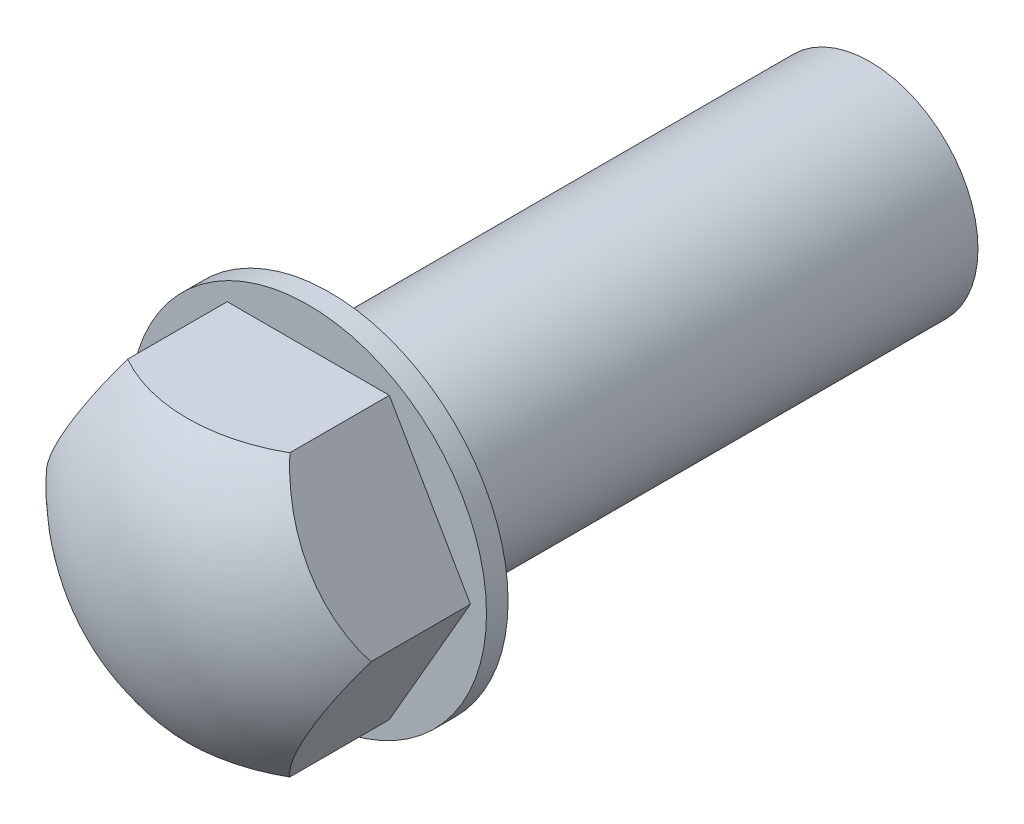
ISO-10303-21;
HEADER;
FILE_DESCRIPTION(('STEP AP214'),'2;1');
FILE_NAME('part.step','',(''),(''),'','','');
FILE_SCHEMA(('AUTOMOTIVE_DESIGN { 1 0 10303 214 1 1 1 1 }'));
ENDSEC;
DATA;
#1=APPLICATION_CONTEXT('core data for automotive mechanical design processes');
#2=APPLICATION_PROTOCOL_DEFINITION('international standard','automotive_design',2000,#1);
#3=PRODUCT_CONTEXT('',#1,'mechanical');
#4=PRODUCT('Part','Part','',(#3));
#5=PRODUCT_RELATED_PRODUCT_CATEGORY('part','',(#4));
#6=PRODUCT_DEFINITION_FORMATION('','',#4);
#7=PRODUCT_DEFINITION_CONTEXT('part definition',#1,'design');
#8=PRODUCT_DEFINITION('design','',#6,#7);
#9=PRODUCT_DEFINITION_SHAPE('','',#8);
#10=(LENGTH_UNIT() NAMED_UNIT(*) SI_UNIT(.MILLI.,.METRE.));
#11=(NAMED_UNIT(*) PLANE_ANGLE_UNIT() SI_UNIT($,.RADIAN.));
#12=(NAMED_UNIT(*) SI_UNIT($,.STERADIAN.) SOLID_ANGLE_UNIT());
#13=UNCERTAINTY_MEASURE_WITH_UNIT(LENGTH_MEASURE(1.E-05),#10,'distance_accuracy_value','');
#14=(GEOMETRIC_REPRESENTATION_CONTEXT(3) GLOBAL_UNCERTAINTY_ASSIGNED_CONTEXT((#13)) GLOBAL_UNIT_ASSIGNED_CONTEXT((#10,
#11,#12)) REPRESENTATION_CONTEXT('',''));
#15=CARTESIAN_POINT('',(0.,0.,0.));
#16=DIRECTION('',(0.,0.,1.));
#17=DIRECTION('',(1.,0.,0.));
#18=AXIS2_PLACEMENT_3D('',#15,#16,#17);
#19=CARTESIAN_POINT('',(0.,0.,0.));
#20=DIRECTION('',(0.,0.,1.));
#21=DIRECTION('',(1.,0.,0.));
#22=AXIS2_PLACEMENT_3D('',#19,#20,#21);
#23=PLANE('',#22);
#24=CARTESIAN_POINT('',(0.,0.,0.));
#25=DIRECTION('',(0.,0.,1.));
#26=DIRECTION('',(1.,0.,0.));
#27=AXIS2_PLACEMENT_3D('',#24,#25,#26);
#28=CIRCLE('',#27,16.5);
#29=CARTESIAN_POINT('',(16.5,0.,0.));
#30=VERTEX_POINT('',#29);
#31=EDGE_CURVE('E105',#30,#30,#28,.T.);
#32=ORIENTED_EDGE('',*,*,#31,.F.);
#33=EDGE_LOOP('',(#32));
#34=FACE_BOUND('',#33,.T.);
#35=CARTESIAN_POINT('',(0.,0.,0.));
#36=DIRECTION('',(0.,0.,1.));
#37=DIRECTION('',(1.,0.,0.));
#38=AXIS2_PLACEMENT_3D('',#35,#36,#37);
#39=CIRCLE('',#38,10.);
#40=CARTESIAN_POINT('',(10.,0.,0.));
#41=VERTEX_POINT('',#40);
#42=EDGE_CURVE('E11',#41,#41,#39,.F.);
#43=ORIENTED_EDGE('',*,*,#42,.F.);
#44=EDGE_LOOP('',(#43));
#45=FACE_BOUND('',#44,.T.);
#46=ADVANCED_FACE('F34',(#34,#45),#23,.F.);
#47=CARTESIAN_POINT('',(0.,0.,2.));
#48=DIRECTION('',(0.,0.,1.));
#49=DIRECTION('',(1.,0.,0.));
#50=AXIS2_PLACEMENT_3D('',#47,#48,#49);
#51=PLANE('',#50);
#52=CARTESIAN_POINT('',(0.,0.,2.));
#53=DIRECTION('',(0.,0.,1.));
#54=DIRECTION('',(1.,0.,0.));
#55=AXIS2_PLACEMENT_3D('',#52,#53,#54);
#56=CIRCLE('',#55,16.5);
#57=CARTESIAN_POINT('',(16.5,0.,2.));
#58=VERTEX_POINT('',#57);
#59=EDGE_CURVE('E43',#58,#58,#56,.T.);
#60=ORIENTED_EDGE('',*,*,#59,.T.);
#61=EDGE_LOOP('',(#60));
#62=FACE_BOUND('',#61,.T.);
#63=DIRECTION('',(-0.5,-0.866025403784439,0.));
#64=VECTOR('',#63,1.);
#65=CARTESIAN_POINT('',(-7.50555349946514,13.,2.));
#66=LINE('',#65,#64);
#67=CARTESIAN_POINT('',(-7.50555349946514,13.,2.));
#68=VERTEX_POINT('',#67);
#69=CARTESIAN_POINT('',(-15.0111069989303,0.,2.));
#70=VERTEX_POINT('',#69);
#71=EDGE_CURVE('E101',#68,#70,#66,.T.);
#72=ORIENTED_EDGE('',*,*,#71,.F.);
#73=DIRECTION('',(-1.,0.,0.));
#74=VECTOR('',#73,1.);
#75=CARTESIAN_POINT('',(7.50555349946514,13.,2.));
#76=LINE('',#75,#74);
#77=CARTESIAN_POINT('',(7.50555349946514,13.,2.));
#78=VERTEX_POINT('',#77);
#79=EDGE_CURVE('E109',#78,#68,#76,.T.);
#80=ORIENTED_EDGE('',*,*,#79,.F.);
#81=DIRECTION('',(-0.5,0.866025403784438,0.));
#82=VECTOR('',#81,1.);
#83=CARTESIAN_POINT('',(15.0111069989303,0.,2.));
#84=LINE('',#83,#82);
#85=CARTESIAN_POINT('',(15.0111069989303,0.,2.));
#86=VERTEX_POINT('',#85);
#87=EDGE_CURVE('E79',#86,#78,#84,.T.);
#88=ORIENTED_EDGE('',*,*,#87,.F.);
#89=DIRECTION('',(0.5,0.866025403784439,0.));
#90=VECTOR('',#89,1.);
#91=CARTESIAN_POINT('',(7.50555349946514,-13.,2.));
#92=LINE('',#91,#90);
#93=CARTESIAN_POINT('',(7.50555349946514,-13.,2.));
#94=VERTEX_POINT('',#93);
#95=EDGE_CURVE('E123',#94,#86,#92,.T.);
#96=ORIENTED_EDGE('',*,*,#95,.F.);
#97=DIRECTION('',(1.,0.,0.));
#98=VECTOR('',#97,1.);
#99=CARTESIAN_POINT('',(-7.50555349946514,-13.,2.));
#100=LINE('',#99,#98);
#101=CARTESIAN_POINT('',(-7.50555349946514,-13.,2.));
#102=VERTEX_POINT('',#101);
#103=EDGE_CURVE('E87',#102,#94,#100,.T.);
#104=ORIENTED_EDGE('',*,*,#103,.F.);
#105=DIRECTION('',(0.5,-0.866025403784438,0.));
#106=VECTOR('',#105,1.);
#107=CARTESIAN_POINT('',(-15.0111069989303,0.,2.));
#108=LINE('',#107,#106);
#109=EDGE_CURVE('E117',#70,#102,#108,.T.);
#110=ORIENTED_EDGE('',*,*,#109,.F.);
#111=EDGE_LOOP('',(#72,#80,#88,#96,#104,#110));
#112=FACE_BOUND('',#111,.T.);
#113=ADVANCED_FACE('F116',(#62,#112),#51,.T.);
#114=CARTESIAN_POINT('',(0.,0.,2.));
#115=DIRECTION('',(0.,0.,-1.));
#116=DIRECTION('',(-1.,0.,0.));
#117=AXIS2_PLACEMENT_3D('',#114,#115,#116);
#118=CYLINDRICAL_SURFACE('',#117,16.5);
#119=ORIENTED_EDGE('',*,*,#59,.F.);
#120=EDGE_LOOP('',(#119));
#121=FACE_BOUND('',#120,.T.);
#122=ORIENTED_EDGE('',*,*,#31,.T.);
#123=EDGE_LOOP('',(#122));
#124=FACE_BOUND('',#123,.T.);
#125=ADVANCED_FACE('F172',(#121,#124),#118,.T.);
#126=CARTESIAN_POINT('',(7.50555349946514,13.,17.));
#127=DIRECTION('',(0.,-1.,0.));
#128=DIRECTION('',(1.,0.,0.));
#129=AXIS2_PLACEMENT_3D('',#126,#127,#128);
#130=PLANE('',#129);
#131=ORIENTED_EDGE('',*,*,#79,.T.);
#132=DIRECTION('',(0.,0.,-1.));
#133=VECTOR('',#132,1.);
#134=CARTESIAN_POINT('',(-7.50555349946514,13.,17.));
#135=LINE('',#134,#133);
#136=CARTESIAN_POINT('',(-7.50555349946514,13.,11.2161517343993));
#137=VERTEX_POINT('',#136);
#138=EDGE_CURVE('E97',#137,#68,#135,.T.);
#139=ORIENTED_EDGE('',*,*,#138,.F.);
#140=CARTESIAN_POINT('',(0.,13.,-2.));
#141=DIRECTION('',(0.,-1.,0.));
#142=DIRECTION('',(1.,0.,0.));
#143=AXIS2_PLACEMENT_3D('',#140,#141,#142);
#144=CIRCLE('',#143,15.1986841535707);
#145=CARTESIAN_POINT('',(7.50555349946514,13.,11.2161517343993));
#146=VERTEX_POINT('',#145);
#147=EDGE_CURVE('E126',#146,#137,#144,.T.);
#148=ORIENTED_EDGE('',*,*,#147,.F.);
#149=DIRECTION('',(0.,0.,-1.));
#150=VECTOR('',#149,1.);
#151=CARTESIAN_POINT('',(7.50555349946514,13.,17.));
#152=LINE('',#151,#150);
#153=EDGE_CURVE('E111',#146,#78,#152,.T.);
#154=ORIENTED_EDGE('',*,*,#153,.T.);
#155=EDGE_LOOP('',(#131,#139,#148,#154));
#156=FACE_BOUND('',#155,.T.);
#157=ADVANCED_FACE('F110',(#156),#130,.F.);
#158=CARTESIAN_POINT('',(-7.50555349946514,13.,17.));
#159=DIRECTION('',(0.866025403784439,-0.5,0.));
#160=DIRECTION('',(0.5,0.866025403784439,0.));
#161=AXIS2_PLACEMENT_3D('',#158,#159,#160);
#162=PLANE('',#161);
#163=ORIENTED_EDGE('',*,*,#71,.T.);
#164=DIRECTION('',(0.,0.,-1.));
#165=VECTOR('',#164,1.);
#166=CARTESIAN_POINT('',(-15.0111069989303,0.,17.));
#167=LINE('',#166,#165);
#168=CARTESIAN_POINT('',(-15.0111069989303,0.,11.2161517343993));
#169=VERTEX_POINT('',#168);
#170=EDGE_CURVE('E106',#169,#70,#167,.T.);
#171=ORIENTED_EDGE('',*,*,#170,.F.);
#172=CARTESIAN_POINT('',(-11.2583302491977,6.5,-2.));
#173=DIRECTION('',(0.866025403784439,-0.5,0.));
#174=DIRECTION('',(0.5,0.866025403784439,0.));
#175=AXIS2_PLACEMENT_3D('',#172,#173,#174);
#176=CIRCLE('',#175,15.1986841535707);
#177=EDGE_CURVE('E72',#137,#169,#176,.T.);
#178=ORIENTED_EDGE('',*,*,#177,.F.);
#179=ORIENTED_EDGE('',*,*,#138,.T.);
#180=EDGE_LOOP('',(#163,#171,#178,#179));
#181=FACE_BOUND('',#180,.T.);
#182=ADVANCED_FACE('F99',(#181),#162,.F.);
#183=CARTESIAN_POINT('',(-15.0111069989303,0.,17.));
#184=DIRECTION('',(0.866025403784438,0.5,0.));
#185=DIRECTION('',(-0.5,0.866025403784439,0.));
#186=AXIS2_PLACEMENT_3D('',#183,#184,#185);
#187=PLANE('',#186);
#188=ORIENTED_EDGE('',*,*,#109,.T.);
#189=DIRECTION('',(0.,0.,-1.));
#190=VECTOR('',#189,1.);
#191=CARTESIAN_POINT('',(-7.50555349946514,-13.,17.));
#192=LINE('',#191,#190);
#193=CARTESIAN_POINT('',(-7.50555349946514,-13.,11.2161517343993));
#194=VERTEX_POINT('',#193);
#195=EDGE_CURVE('E132',#194,#102,#192,.T.);
#196=ORIENTED_EDGE('',*,*,#195,.F.);
#197=CARTESIAN_POINT('',(-11.2583302491977,-6.5,-2.));
#198=DIRECTION('',(0.866025403784438,0.5,0.));
#199=DIRECTION('',(-0.5,0.866025403784439,0.));
#200=AXIS2_PLACEMENT_3D('',#197,#198,#199);
#201=CIRCLE('',#200,15.1986841535707);
#202=EDGE_CURVE('E145',#169,#194,#201,.T.);
#203=ORIENTED_EDGE('',*,*,#202,.F.);
#204=ORIENTED_EDGE('',*,*,#170,.T.);
#205=EDGE_LOOP('',(#188,#196,#203,#204));
#206=FACE_BOUND('',#205,.T.);
#207=ADVANCED_FACE('F150',(#206),#187,.F.);
#208=CARTESIAN_POINT('',(-7.50555349946514,-13.,17.));
#209=DIRECTION('',(0.,1.,0.));
#210=DIRECTION('',(0.,0.,1.));
#211=AXIS2_PLACEMENT_3D('',#208,#209,#210);
#212=PLANE('',#211);
#213=ORIENTED_EDGE('',*,*,#103,.T.);
#214=DIRECTION('',(0.,0.,-1.));
#215=VECTOR('',#214,1.);
#216=CARTESIAN_POINT('',(7.50555349946514,-13.,17.));
#217=LINE('',#216,#215);
#218=CARTESIAN_POINT('',(7.50555349946514,-13.,11.2161517343993));
#219=VERTEX_POINT('',#218);
#220=EDGE_CURVE('E130',#219,#94,#217,.T.);
#221=ORIENTED_EDGE('',*,*,#220,.F.);
#222=CARTESIAN_POINT('',(0.,-13.,-2.));
#223=DIRECTION('',(0.,1.,0.));
#224=DIRECTION('',(0.,0.,1.));
#225=AXIS2_PLACEMENT_3D('',#222,#223,#224);
#226=CIRCLE('',#225,15.1986841535707);
#227=EDGE_CURVE('E143',#194,#219,#226,.T.);
#228=ORIENTED_EDGE('',*,*,#227,.F.);
#229=ORIENTED_EDGE('',*,*,#195,.T.);
#230=EDGE_LOOP('',(#213,#221,#228,#229));
#231=FACE_BOUND('',#230,.T.);
#232=ADVANCED_FACE('F151',(#231),#212,.F.);
#233=CARTESIAN_POINT('',(7.50555349946514,-13.,17.));
#234=DIRECTION('',(-0.866025403784439,0.5,0.));
#235=DIRECTION('',(-0.5,-0.866025403784439,0.));
#236=AXIS2_PLACEMENT_3D('',#233,#234,#235);
#237=PLANE('',#236);
#238=ORIENTED_EDGE('',*,*,#95,.T.);
#239=DIRECTION('',(0.,0.,-1.));
#240=VECTOR('',#239,1.);
#241=CARTESIAN_POINT('',(15.0111069989303,0.,17.));
#242=LINE('',#241,#240);
#243=CARTESIAN_POINT('',(15.0111069989303,0.,11.2161517343993));
#244=VERTEX_POINT('',#243);
#245=EDGE_CURVE('E51',#244,#86,#242,.T.);
#246=ORIENTED_EDGE('',*,*,#245,.F.);
#247=CARTESIAN_POINT('',(11.2583302491977,-6.50000000000001,-2.));
#248=DIRECTION('',(-0.866025403784439,0.5,0.));
#249=DIRECTION('',(-0.5,-0.866025403784439,0.));
#250=AXIS2_PLACEMENT_3D('',#247,#248,#249);
#251=CIRCLE('',#250,15.1986841535707);
#252=EDGE_CURVE('E141',#219,#244,#251,.T.);
#253=ORIENTED_EDGE('',*,*,#252,.F.);
#254=ORIENTED_EDGE('',*,*,#220,.T.);
#255=EDGE_LOOP('',(#238,#246,#253,#254));
#256=FACE_BOUND('',#255,.T.);
#257=ADVANCED_FACE('F155',(#256),#237,.F.);
#258=CARTESIAN_POINT('',(15.0111069989303,0.,17.));
#259=DIRECTION('',(-0.866025403784439,-0.5,0.));
#260=DIRECTION('',(0.5,-0.866025403784439,0.));
#261=AXIS2_PLACEMENT_3D('',#258,#259,#260);
#262=PLANE('',#261);
#263=ORIENTED_EDGE('',*,*,#87,.T.);
#264=ORIENTED_EDGE('',*,*,#153,.F.);
#265=CARTESIAN_POINT('',(11.2583302491977,6.50000000000001,-2.));
#266=DIRECTION('',(-0.866025403784439,-0.5,0.));
#267=DIRECTION('',(0.5,-0.866025403784439,0.));
#268=AXIS2_PLACEMENT_3D('',#265,#266,#267);
#269=CIRCLE('',#268,15.1986841535707);
#270=EDGE_CURVE('E128',#244,#146,#269,.T.);
#271=ORIENTED_EDGE('',*,*,#270,.F.);
#272=ORIENTED_EDGE('',*,*,#245,.T.);
#273=EDGE_LOOP('',(#263,#264,#271,#272));
#274=FACE_BOUND('',#273,.T.);
#275=ADVANCED_FACE('F156',(#274),#262,.F.);
#276=CARTESIAN_POINT('',(0.,0.,-2.));
#277=DIRECTION('',(0.,0.,1.));
#278=DIRECTION('',(0.,1.,0.));
#279=AXIS2_PLACEMENT_3D('',#276,#277,#278);
#280=SPHERICAL_SURFACE('',#279,20.);
#281=ORIENTED_EDGE('',*,*,#147,.T.);
#282=ORIENTED_EDGE('',*,*,#177,.T.);
#283=ORIENTED_EDGE('',*,*,#202,.T.);
#284=ORIENTED_EDGE('',*,*,#227,.T.);
#285=ORIENTED_EDGE('',*,*,#252,.T.);
#286=ORIENTED_EDGE('',*,*,#270,.T.);
#287=EDGE_LOOP('',(#281,#282,#283,#284,#285,#286));
#288=FACE_BOUND('',#287,.T.);
#289=ADVANCED_FACE('F36',(#288),#280,.T.);
#290=CARTESIAN_POINT('',(0.,0.,-50.));
#291=DIRECTION('',(0.,0.,1.));
#292=DIRECTION('',(1.,0.,0.));
#293=AXIS2_PLACEMENT_3D('',#290,#291,#292);
#294=CYLINDRICAL_SURFACE('',#293,10.);
#295=CARTESIAN_POINT('',(0.,0.,-50.));
#296=DIRECTION('',(0.,0.,-1.));
#297=DIRECTION('',(-1.,0.,0.));
#298=AXIS2_PLACEMENT_3D('',#295,#296,#297);
#299=CIRCLE('',#298,10.);
#300=CARTESIAN_POINT('',(-10.,0.,-50.));
#301=VERTEX_POINT('',#300);
#302=EDGE_CURVE('E113',#301,#301,#299,.T.);
#303=ORIENTED_EDGE('',*,*,#302,.F.);
#304=EDGE_LOOP('',(#303));
#305=FACE_BOUND('',#304,.T.);
#306=ORIENTED_EDGE('',*,*,#42,.T.);
#307=EDGE_LOOP('',(#306));
#308=FACE_BOUND('',#307,.T.);
#309=ADVANCED_FACE('F163',(#305,#308),#294,.T.);
#310=CARTESIAN_POINT('',(0.,0.,-50.));
#311=DIRECTION('',(0.,0.,-1.));
#312=DIRECTION('',(-1.,0.,0.));
#313=AXIS2_PLACEMENT_3D('',#310,#311,#312);
#314=PLANE('',#313);
#315=ORIENTED_EDGE('',*,*,#302,.T.);
#316=EDGE_LOOP('',(#315));
#317=FACE_BOUND('',#316,.T.);
#318=ADVANCED_FACE('F224',(#317),#314,.T.);
#319=CLOSED_SHELL('',(#46,#113,#125,#157,#182,#207,#232,#257,#275,#289,#309,#318));
#320=MANIFOLD_SOLID_BREP('B2',#319);
#321=ADVANCED_BREP_SHAPE_REPRESENTATION('',(#18,#320),#14);
#322=SHAPE_DEFINITION_REPRESENTATION(#9,#321);
ENDSEC;
END-ISO-10303-21;
